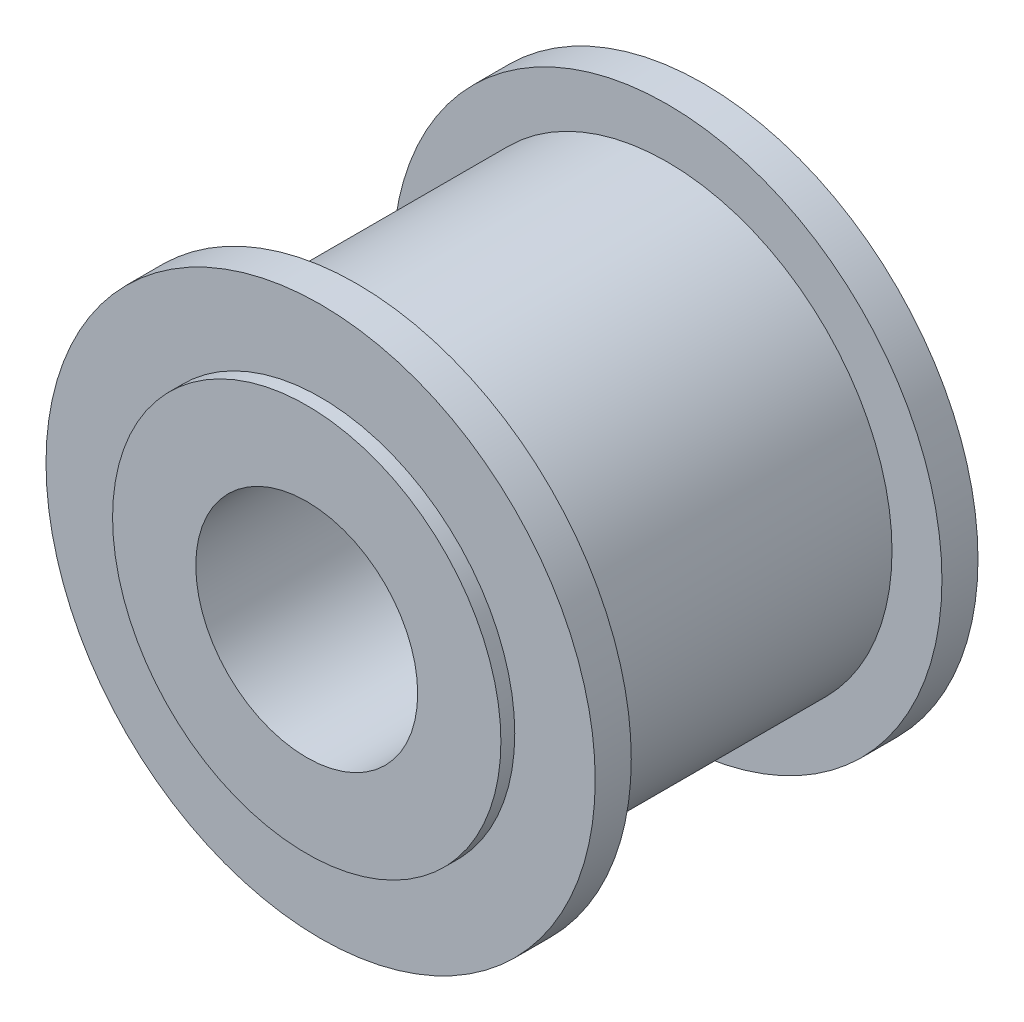
ISO-10303-21;
HEADER;
FILE_DESCRIPTION(('STEP AP214'),'2;1');
FILE_NAME('part.step','',(''),(''),'','','');
FILE_SCHEMA(('AUTOMOTIVE_DESIGN { 1 0 10303 214 1 1 1 1 }'));
ENDSEC;
DATA;
#1=APPLICATION_CONTEXT('core data for automotive mechanical design processes');
#2=APPLICATION_PROTOCOL_DEFINITION('international standard','automotive_design',2000,#1);
#3=PRODUCT_CONTEXT('',#1,'mechanical');
#4=PRODUCT('Part','Part','',(#3));
#5=PRODUCT_RELATED_PRODUCT_CATEGORY('part','',(#4));
#6=PRODUCT_DEFINITION_FORMATION('','',#4);
#7=PRODUCT_DEFINITION_CONTEXT('part definition',#1,'design');
#8=PRODUCT_DEFINITION('design','',#6,#7);
#9=PRODUCT_DEFINITION_SHAPE('','',#8);
#10=(LENGTH_UNIT() NAMED_UNIT(*) SI_UNIT(.MILLI.,.METRE.));
#11=(NAMED_UNIT(*) PLANE_ANGLE_UNIT() SI_UNIT($,.RADIAN.));
#12=(NAMED_UNIT(*) SI_UNIT($,.STERADIAN.) SOLID_ANGLE_UNIT());
#13=UNCERTAINTY_MEASURE_WITH_UNIT(LENGTH_MEASURE(1.E-05),#10,'distance_accuracy_value','');
#14=(GEOMETRIC_REPRESENTATION_CONTEXT(3) GLOBAL_UNCERTAINTY_ASSIGNED_CONTEXT((#13)) GLOBAL_UNIT_ASSIGNED_CONTEXT((#10,
#11,#12)) REPRESENTATION_CONTEXT('',''));
#15=CARTESIAN_POINT('',(0.,0.,0.));
#16=DIRECTION('',(0.,0.,1.));
#17=DIRECTION('',(1.,0.,0.));
#18=AXIS2_PLACEMENT_3D('',#15,#16,#17);
#19=CARTESIAN_POINT('',(0.,0.,0.5));
#20=DIRECTION('',(0.,0.,-1.));
#21=DIRECTION('',(-1.,0.,0.));
#22=AXIS2_PLACEMENT_3D('',#19,#20,#21);
#23=CYLINDRICAL_SURFACE('',#22,7.);
#24=CARTESIAN_POINT('',(0.,0.,0.5));
#25=DIRECTION('',(0.,0.,1.));
#26=DIRECTION('',(1.,0.,0.));
#27=AXIS2_PLACEMENT_3D('',#24,#25,#26);
#28=CIRCLE('',#27,7.);
#29=CARTESIAN_POINT('',(7.,0.,0.5));
#30=VERTEX_POINT('',#29);
#31=EDGE_CURVE('E49',#30,#30,#28,.T.);
#32=ORIENTED_EDGE('',*,*,#31,.F.);
#33=EDGE_LOOP('',(#32));
#34=FACE_BOUND('',#33,.T.);
#35=CARTESIAN_POINT('',(0.,0.,0.));
#36=DIRECTION('',(0.,0.,1.));
#37=DIRECTION('',(1.,0.,0.));
#38=AXIS2_PLACEMENT_3D('',#35,#36,#37);
#39=CIRCLE('',#38,7.);
#40=CARTESIAN_POINT('',(7.,0.,0.));
#41=VERTEX_POINT('',#40);
#42=EDGE_CURVE('E40',#41,#41,#39,.T.);
#43=ORIENTED_EDGE('',*,*,#42,.T.);
#44=EDGE_LOOP('',(#43));
#45=FACE_BOUND('',#44,.T.);
#46=ADVANCED_FACE('F37',(#34,#45),#23,.T.);
#47=CARTESIAN_POINT('',(0.,0.,0.));
#48=DIRECTION('',(0.,0.,1.));
#49=DIRECTION('',(1.,0.,0.));
#50=AXIS2_PLACEMENT_3D('',#47,#48,#49);
#51=PLANE('',#50);
#52=CARTESIAN_POINT('',(0.,0.,0.));
#53=DIRECTION('',(0.,0.,1.));
#54=DIRECTION('',(1.,0.,0.));
#55=AXIS2_PLACEMENT_3D('',#52,#53,#54);
#56=CIRCLE('',#55,4.);
#57=CARTESIAN_POINT('',(4.,0.,0.));
#58=VERTEX_POINT('',#57);
#59=EDGE_CURVE('E127',#58,#58,#56,.T.);
#60=ORIENTED_EDGE('',*,*,#59,.T.);
#61=EDGE_LOOP('',(#60));
#62=FACE_BOUND('',#61,.T.);
#63=ORIENTED_EDGE('',*,*,#42,.F.);
#64=EDGE_LOOP('',(#63));
#65=FACE_BOUND('',#64,.T.);
#66=ADVANCED_FACE('F76',(#62,#65),#51,.F.);
#67=CARTESIAN_POINT('',(0.,0.,1.8));
#68=DIRECTION('',(0.,0.,-1.));
#69=DIRECTION('',(-1.,0.,0.));
#70=AXIS2_PLACEMENT_3D('',#67,#68,#69);
#71=CYLINDRICAL_SURFACE('',#70,9.9);
#72=CARTESIAN_POINT('',(0.,0.,1.8));
#73=DIRECTION('',(0.,0.,1.));
#74=DIRECTION('',(1.,0.,0.));
#75=AXIS2_PLACEMENT_3D('',#72,#73,#74);
#76=CIRCLE('',#75,9.9);
#77=CARTESIAN_POINT('',(9.9,0.,1.8));
#78=VERTEX_POINT('',#77);
#79=EDGE_CURVE('E65',#78,#78,#76,.T.);
#80=ORIENTED_EDGE('',*,*,#79,.F.);
#81=EDGE_LOOP('',(#80));
#82=FACE_BOUND('',#81,.T.);
#83=CARTESIAN_POINT('',(0.,0.,0.5));
#84=DIRECTION('',(0.,0.,1.));
#85=DIRECTION('',(1.,0.,0.));
#86=AXIS2_PLACEMENT_3D('',#83,#84,#85);
#87=CIRCLE('',#86,9.9);
#88=CARTESIAN_POINT('',(9.9,0.,0.5));
#89=VERTEX_POINT('',#88);
#90=EDGE_CURVE('E63',#89,#89,#87,.T.);
#91=ORIENTED_EDGE('',*,*,#90,.T.);
#92=EDGE_LOOP('',(#91));
#93=FACE_BOUND('',#92,.T.);
#94=ADVANCED_FACE('F78',(#82,#93),#71,.T.);
#95=CARTESIAN_POINT('',(0.,0.,1.8));
#96=DIRECTION('',(0.,0.,1.));
#97=DIRECTION('',(1.,0.,0.));
#98=AXIS2_PLACEMENT_3D('',#95,#96,#97);
#99=PLANE('',#98);
#100=CARTESIAN_POINT('',(0.,0.,1.8));
#101=DIRECTION('',(0.,0.,1.));
#102=DIRECTION('',(1.,0.,0.));
#103=AXIS2_PLACEMENT_3D('',#100,#101,#102);
#104=CIRCLE('',#103,8.1);
#105=CARTESIAN_POINT('',(8.1,0.,1.8));
#106=VERTEX_POINT('',#105);
#107=EDGE_CURVE('E44',#106,#106,#104,.T.);
#108=ORIENTED_EDGE('',*,*,#107,.F.);
#109=EDGE_LOOP('',(#108));
#110=FACE_BOUND('',#109,.T.);
#111=ORIENTED_EDGE('',*,*,#79,.T.);
#112=EDGE_LOOP('',(#111));
#113=FACE_BOUND('',#112,.T.);
#114=ADVANCED_FACE('F85',(#110,#113),#99,.T.);
#115=CARTESIAN_POINT('',(0.,0.,0.5));
#116=DIRECTION('',(0.,0.,1.));
#117=DIRECTION('',(1.,0.,0.));
#118=AXIS2_PLACEMENT_3D('',#115,#116,#117);
#119=PLANE('',#118);
#120=ORIENTED_EDGE('',*,*,#31,.T.);
#121=EDGE_LOOP('',(#120));
#122=FACE_BOUND('',#121,.T.);
#123=ORIENTED_EDGE('',*,*,#90,.F.);
#124=EDGE_LOOP('',(#123));
#125=FACE_BOUND('',#124,.T.);
#126=ADVANCED_FACE('F92',(#122,#125),#119,.F.);
#127=CARTESIAN_POINT('',(0.,0.,13.));
#128=DIRECTION('',(0.,0.,-1.));
#129=DIRECTION('',(-1.,0.,0.));
#130=AXIS2_PLACEMENT_3D('',#127,#128,#129);
#131=CYLINDRICAL_SURFACE('',#130,8.1);
#132=CARTESIAN_POINT('',(0.,0.,13.));
#133=DIRECTION('',(0.,0.,1.));
#134=DIRECTION('',(1.,0.,0.));
#135=AXIS2_PLACEMENT_3D('',#132,#133,#134);
#136=CIRCLE('',#135,8.1);
#137=CARTESIAN_POINT('',(8.1,0.,13.));
#138=VERTEX_POINT('',#137);
#139=EDGE_CURVE('E58',#138,#138,#136,.T.);
#140=ORIENTED_EDGE('',*,*,#139,.F.);
#141=EDGE_LOOP('',(#140));
#142=FACE_BOUND('',#141,.T.);
#143=ORIENTED_EDGE('',*,*,#107,.T.);
#144=EDGE_LOOP('',(#143));
#145=FACE_BOUND('',#144,.T.);
#146=ADVANCED_FACE('F95',(#142,#145),#131,.T.);
#147=CARTESIAN_POINT('',(0.,0.,14.3));
#148=DIRECTION('',(0.,0.,-1.));
#149=DIRECTION('',(-1.,0.,0.));
#150=AXIS2_PLACEMENT_3D('',#147,#148,#149);
#151=CYLINDRICAL_SURFACE('',#150,9.9);
#152=CARTESIAN_POINT('',(0.,0.,14.3));
#153=DIRECTION('',(0.,0.,1.));
#154=DIRECTION('',(1.,0.,0.));
#155=AXIS2_PLACEMENT_3D('',#152,#153,#154);
#156=CIRCLE('',#155,9.9);
#157=CARTESIAN_POINT('',(9.9,0.,14.3));
#158=VERTEX_POINT('',#157);
#159=EDGE_CURVE('E55',#158,#158,#156,.T.);
#160=ORIENTED_EDGE('',*,*,#159,.F.);
#161=EDGE_LOOP('',(#160));
#162=FACE_BOUND('',#161,.T.);
#163=CARTESIAN_POINT('',(0.,0.,13.));
#164=DIRECTION('',(0.,0.,1.));
#165=DIRECTION('',(1.,0.,0.));
#166=AXIS2_PLACEMENT_3D('',#163,#164,#165);
#167=CIRCLE('',#166,9.9);
#168=CARTESIAN_POINT('',(9.9,0.,13.));
#169=VERTEX_POINT('',#168);
#170=EDGE_CURVE('E59',#169,#169,#167,.T.);
#171=ORIENTED_EDGE('',*,*,#170,.T.);
#172=EDGE_LOOP('',(#171));
#173=FACE_BOUND('',#172,.T.);
#174=ADVANCED_FACE('F101',(#162,#173),#151,.T.);
#175=CARTESIAN_POINT('',(0.,0.,14.3));
#176=DIRECTION('',(0.,0.,1.));
#177=DIRECTION('',(1.,0.,0.));
#178=AXIS2_PLACEMENT_3D('',#175,#176,#177);
#179=PLANE('',#178);
#180=CARTESIAN_POINT('',(0.,0.,14.3));
#181=DIRECTION('',(0.,0.,1.));
#182=DIRECTION('',(1.,0.,0.));
#183=AXIS2_PLACEMENT_3D('',#180,#181,#182);
#184=CIRCLE('',#183,7.);
#185=CARTESIAN_POINT('',(7.,0.,14.3));
#186=VERTEX_POINT('',#185);
#187=EDGE_CURVE('E10',#186,#186,#184,.T.);
#188=ORIENTED_EDGE('',*,*,#187,.F.);
#189=EDGE_LOOP('',(#188));
#190=FACE_BOUND('',#189,.T.);
#191=ORIENTED_EDGE('',*,*,#159,.T.);
#192=EDGE_LOOP('',(#191));
#193=FACE_BOUND('',#192,.T.);
#194=ADVANCED_FACE('F105',(#190,#193),#179,.T.);
#195=CARTESIAN_POINT('',(0.,0.,13.));
#196=DIRECTION('',(0.,0.,1.));
#197=DIRECTION('',(1.,0.,0.));
#198=AXIS2_PLACEMENT_3D('',#195,#196,#197);
#199=PLANE('',#198);
#200=ORIENTED_EDGE('',*,*,#139,.T.);
#201=EDGE_LOOP('',(#200));
#202=FACE_BOUND('',#201,.T.);
#203=ORIENTED_EDGE('',*,*,#170,.F.);
#204=EDGE_LOOP('',(#203));
#205=FACE_BOUND('',#204,.T.);
#206=ADVANCED_FACE('F107',(#202,#205),#199,.F.);
#207=CARTESIAN_POINT('',(0.,0.,14.8));
#208=DIRECTION('',(0.,0.,-1.));
#209=DIRECTION('',(-1.,0.,0.));
#210=AXIS2_PLACEMENT_3D('',#207,#208,#209);
#211=CYLINDRICAL_SURFACE('',#210,7.);
#212=CARTESIAN_POINT('',(0.,0.,14.8));
#213=DIRECTION('',(0.,0.,1.));
#214=DIRECTION('',(1.,0.,0.));
#215=AXIS2_PLACEMENT_3D('',#212,#213,#214);
#216=CIRCLE('',#215,7.);
#217=CARTESIAN_POINT('',(7.,0.,14.8));
#218=VERTEX_POINT('',#217);
#219=EDGE_CURVE('E53',#218,#218,#216,.T.);
#220=ORIENTED_EDGE('',*,*,#219,.F.);
#221=EDGE_LOOP('',(#220));
#222=FACE_BOUND('',#221,.T.);
#223=ORIENTED_EDGE('',*,*,#187,.T.);
#224=EDGE_LOOP('',(#223));
#225=FACE_BOUND('',#224,.T.);
#226=ADVANCED_FACE('F110',(#222,#225),#211,.T.);
#227=CARTESIAN_POINT('',(0.,0.,14.8));
#228=DIRECTION('',(0.,0.,1.));
#229=DIRECTION('',(1.,0.,0.));
#230=AXIS2_PLACEMENT_3D('',#227,#228,#229);
#231=PLANE('',#230);
#232=CARTESIAN_POINT('',(0.,0.,14.8));
#233=DIRECTION('',(0.,0.,1.));
#234=DIRECTION('',(1.,0.,0.));
#235=AXIS2_PLACEMENT_3D('',#232,#233,#234);
#236=CIRCLE('',#235,4.);
#237=CARTESIAN_POINT('',(4.,0.,14.8));
#238=VERTEX_POINT('',#237);
#239=EDGE_CURVE('E130',#238,#238,#236,.T.);
#240=ORIENTED_EDGE('',*,*,#239,.F.);
#241=EDGE_LOOP('',(#240));
#242=FACE_BOUND('',#241,.T.);
#243=ORIENTED_EDGE('',*,*,#219,.T.);
#244=EDGE_LOOP('',(#243));
#245=FACE_BOUND('',#244,.T.);
#246=ADVANCED_FACE('F116',(#242,#245),#231,.T.);
#247=CARTESIAN_POINT('',(0.,0.,0.));
#248=DIRECTION('',(0.,0.,1.));
#249=DIRECTION('',(1.,0.,0.));
#250=AXIS2_PLACEMENT_3D('',#247,#248,#249);
#251=CYLINDRICAL_SURFACE('',#250,4.);
#252=ORIENTED_EDGE('',*,*,#59,.F.);
#253=EDGE_LOOP('',(#252));
#254=FACE_BOUND('',#253,.T.);
#255=ORIENTED_EDGE('',*,*,#239,.T.);
#256=EDGE_LOOP('',(#255));
#257=FACE_BOUND('',#256,.T.);
#258=ADVANCED_FACE('F119',(#254,#257),#251,.F.);
#259=CLOSED_SHELL('',(#46,#66,#94,#114,#126,#146,#174,#194,#206,#226,#246,#258));
#260=MANIFOLD_SOLID_BREP('B2',#259);
#261=ADVANCED_BREP_SHAPE_REPRESENTATION('',(#18,#260),#14);
#262=SHAPE_DEFINITION_REPRESENTATION(#9,#261);
ENDSEC;
END-ISO-10303-21;
